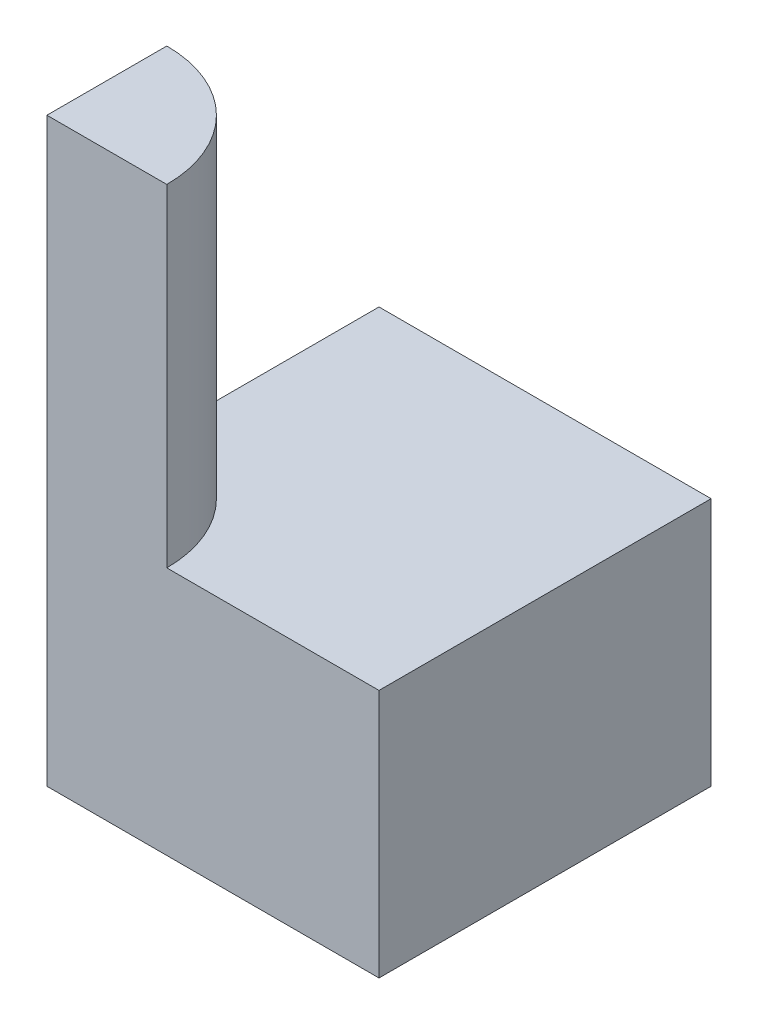
ISO-10303-21;
HEADER;
FILE_DESCRIPTION(('STEP AP214'),'2;1');
FILE_NAME('part.step','',(''),(''),'','','');
FILE_SCHEMA(('AUTOMOTIVE_DESIGN { 1 0 10303 214 1 1 1 1 }'));
ENDSEC;
DATA;
#1=APPLICATION_CONTEXT('core data for automotive mechanical design processes');
#2=APPLICATION_PROTOCOL_DEFINITION('international standard','automotive_design',2000,#1);
#3=PRODUCT_CONTEXT('',#1,'mechanical');
#4=PRODUCT('Part','Part','',(#3));
#5=PRODUCT_RELATED_PRODUCT_CATEGORY('part','',(#4));
#6=PRODUCT_DEFINITION_FORMATION('','',#4);
#7=PRODUCT_DEFINITION_CONTEXT('part definition',#1,'design');
#8=PRODUCT_DEFINITION('design','',#6,#7);
#9=PRODUCT_DEFINITION_SHAPE('','',#8);
#10=(LENGTH_UNIT() NAMED_UNIT(*) SI_UNIT(.MILLI.,.METRE.));
#11=(NAMED_UNIT(*) PLANE_ANGLE_UNIT() SI_UNIT($,.RADIAN.));
#12=(NAMED_UNIT(*) SI_UNIT($,.STERADIAN.) SOLID_ANGLE_UNIT());
#13=UNCERTAINTY_MEASURE_WITH_UNIT(LENGTH_MEASURE(1.E-05),#10,'distance_accuracy_value','');
#14=(GEOMETRIC_REPRESENTATION_CONTEXT(3) GLOBAL_UNCERTAINTY_ASSIGNED_CONTEXT((#13)) GLOBAL_UNIT_ASSIGNED_CONTEXT((#10,
#11,#12)) REPRESENTATION_CONTEXT('',''));
#15=CARTESIAN_POINT('',(0.,0.,0.));
#16=DIRECTION('',(0.,0.,1.));
#17=DIRECTION('',(1.,0.,0.));
#18=AXIS2_PLACEMENT_3D('',#15,#16,#17);
#19=CARTESIAN_POINT('',(0.,19.05,0.));
#20=DIRECTION('',(1.,0.,0.));
#21=DIRECTION('',(0.,0.,-1.));
#22=AXIS2_PLACEMENT_3D('',#19,#20,#21);
#23=PLANE('',#22);
#24=DIRECTION('',(0.,0.,1.));
#25=VECTOR('',#24,1.);
#26=CARTESIAN_POINT('',(0.,0.,0.));
#27=LINE('',#26,#25);
#28=CARTESIAN_POINT('',(0.,0.,-25.4));
#29=VERTEX_POINT('',#28);
#30=CARTESIAN_POINT('',(0.,0.,0.));
#31=VERTEX_POINT('',#30);
#32=EDGE_CURVE('E119',#29,#31,#27,.T.);
#33=ORIENTED_EDGE('',*,*,#32,.T.);
#34=DIRECTION('',(0.,-1.,0.));
#35=VECTOR('',#34,1.);
#36=CARTESIAN_POINT('',(0.,19.05,0.));
#37=LINE('',#36,#35);
#38=CARTESIAN_POINT('',(0.,44.45,0.));
#39=VERTEX_POINT('',#38);
#40=EDGE_CURVE('E11',#39,#31,#37,.T.);
#41=ORIENTED_EDGE('',*,*,#40,.F.);
#42=DIRECTION('',(0.,0.,1.));
#43=VECTOR('',#42,1.);
#44=CARTESIAN_POINT('',(0.,44.45,0.));
#45=LINE('',#44,#43);
#46=CARTESIAN_POINT('',(0.,44.45,-9.1694));
#47=VERTEX_POINT('',#46);
#48=EDGE_CURVE('E109',#47,#39,#45,.T.);
#49=ORIENTED_EDGE('',*,*,#48,.F.);
#50=DIRECTION('',(0.,-1.,0.));
#51=VECTOR('',#50,1.);
#52=CARTESIAN_POINT('',(0.,44.45,-9.1694));
#53=LINE('',#52,#51);
#54=CARTESIAN_POINT('',(0.,19.05,-9.1694));
#55=VERTEX_POINT('',#54);
#56=EDGE_CURVE('E104',#47,#55,#53,.T.);
#57=ORIENTED_EDGE('',*,*,#56,.T.);
#58=DIRECTION('',(0.,0.,1.));
#59=VECTOR('',#58,1.);
#60=CARTESIAN_POINT('',(0.,19.05,0.));
#61=LINE('',#60,#59);
#62=CARTESIAN_POINT('',(0.,19.05,-25.4));
#63=VERTEX_POINT('',#62);
#64=EDGE_CURVE('E129',#63,#55,#61,.T.);
#65=ORIENTED_EDGE('',*,*,#64,.F.);
#66=DIRECTION('',(0.,-1.,0.));
#67=VECTOR('',#66,1.);
#68=CARTESIAN_POINT('',(0.,19.05,-25.4));
#69=LINE('',#68,#67);
#70=EDGE_CURVE('E138',#63,#29,#69,.T.);
#71=ORIENTED_EDGE('',*,*,#70,.T.);
#72=EDGE_LOOP('',(#33,#41,#49,#57,#65,#71));
#73=FACE_BOUND('',#72,.T.);
#74=ADVANCED_FACE('F39',(#73),#23,.F.);
#75=CARTESIAN_POINT('',(0.,19.05,0.));
#76=DIRECTION('',(0.,0.,-1.));
#77=DIRECTION('',(-1.,0.,0.));
#78=AXIS2_PLACEMENT_3D('',#75,#76,#77);
#79=PLANE('',#78);
#80=DIRECTION('',(1.,0.,0.));
#81=VECTOR('',#80,1.);
#82=CARTESIAN_POINT('',(0.,0.,0.));
#83=LINE('',#82,#81);
#84=CARTESIAN_POINT('',(25.4,0.,0.));
#85=VERTEX_POINT('',#84);
#86=EDGE_CURVE('E124',#31,#85,#83,.T.);
#87=ORIENTED_EDGE('',*,*,#86,.T.);
#88=DIRECTION('',(0.,-1.,0.));
#89=VECTOR('',#88,1.);
#90=CARTESIAN_POINT('',(25.4,19.05,0.));
#91=LINE('',#90,#89);
#92=CARTESIAN_POINT('',(25.4,19.05,0.));
#93=VERTEX_POINT('',#92);
#94=EDGE_CURVE('E47',#93,#85,#91,.T.);
#95=ORIENTED_EDGE('',*,*,#94,.F.);
#96=DIRECTION('',(1.,0.,0.));
#97=VECTOR('',#96,1.);
#98=CARTESIAN_POINT('',(0.,19.05,0.));
#99=LINE('',#98,#97);
#100=CARTESIAN_POINT('',(9.1694,19.05,0.));
#101=VERTEX_POINT('',#100);
#102=EDGE_CURVE('E83',#101,#93,#99,.T.);
#103=ORIENTED_EDGE('',*,*,#102,.F.);
#104=DIRECTION('',(0.,-1.,0.));
#105=VECTOR('',#104,1.);
#106=CARTESIAN_POINT('',(9.1694,44.45,0.));
#107=LINE('',#106,#105);
#108=CARTESIAN_POINT('',(9.1694,44.45,0.));
#109=VERTEX_POINT('',#108);
#110=EDGE_CURVE('E102',#109,#101,#107,.T.);
#111=ORIENTED_EDGE('',*,*,#110,.F.);
#112=DIRECTION('',(1.,0.,0.));
#113=VECTOR('',#112,1.);
#114=CARTESIAN_POINT('',(0.,44.45,0.));
#115=LINE('',#114,#113);
#116=EDGE_CURVE('E110',#39,#109,#115,.T.);
#117=ORIENTED_EDGE('',*,*,#116,.F.);
#118=ORIENTED_EDGE('',*,*,#40,.T.);
#119=EDGE_LOOP('',(#87,#95,#103,#111,#117,#118));
#120=FACE_BOUND('',#119,.T.);
#121=ADVANCED_FACE('F117',(#120),#79,.F.);
#122=CARTESIAN_POINT('',(25.4,19.05,0.));
#123=DIRECTION('',(-1.,0.,0.));
#124=DIRECTION('',(0.,0.,1.));
#125=AXIS2_PLACEMENT_3D('',#122,#123,#124);
#126=PLANE('',#125);
#127=DIRECTION('',(0.,0.,-1.));
#128=VECTOR('',#127,1.);
#129=CARTESIAN_POINT('',(25.4,0.,0.));
#130=LINE('',#129,#128);
#131=CARTESIAN_POINT('',(25.4,0.,-25.4));
#132=VERTEX_POINT('',#131);
#133=EDGE_CURVE('E142',#85,#132,#130,.T.);
#134=ORIENTED_EDGE('',*,*,#133,.T.);
#135=DIRECTION('',(0.,-1.,0.));
#136=VECTOR('',#135,1.);
#137=CARTESIAN_POINT('',(25.4,19.05,-25.4));
#138=LINE('',#137,#136);
#139=CARTESIAN_POINT('',(25.4,19.05,-25.4));
#140=VERTEX_POINT('',#139);
#141=EDGE_CURVE('E149',#140,#132,#138,.T.);
#142=ORIENTED_EDGE('',*,*,#141,.F.);
#143=DIRECTION('',(0.,0.,-1.));
#144=VECTOR('',#143,1.);
#145=CARTESIAN_POINT('',(25.4,19.05,0.));
#146=LINE('',#145,#144);
#147=EDGE_CURVE('E134',#93,#140,#146,.T.);
#148=ORIENTED_EDGE('',*,*,#147,.F.);
#149=ORIENTED_EDGE('',*,*,#94,.T.);
#150=EDGE_LOOP('',(#134,#142,#148,#149));
#151=FACE_BOUND('',#150,.T.);
#152=ADVANCED_FACE('F156',(#151),#126,.F.);
#153=CARTESIAN_POINT('',(0.,19.05,-25.4));
#154=DIRECTION('',(0.,0.,1.));
#155=DIRECTION('',(1.,0.,0.));
#156=AXIS2_PLACEMENT_3D('',#153,#154,#155);
#157=PLANE('',#156);
#158=DIRECTION('',(-1.,0.,0.));
#159=VECTOR('',#158,1.);
#160=CARTESIAN_POINT('',(0.,0.,-25.4));
#161=LINE('',#160,#159);
#162=EDGE_CURVE('E81',#132,#29,#161,.T.);
#163=ORIENTED_EDGE('',*,*,#162,.T.);
#164=ORIENTED_EDGE('',*,*,#70,.F.);
#165=DIRECTION('',(-1.,0.,0.));
#166=VECTOR('',#165,1.);
#167=CARTESIAN_POINT('',(0.,19.05,-25.4));
#168=LINE('',#167,#166);
#169=EDGE_CURVE('E61',#140,#63,#168,.T.);
#170=ORIENTED_EDGE('',*,*,#169,.F.);
#171=ORIENTED_EDGE('',*,*,#141,.T.);
#172=EDGE_LOOP('',(#163,#164,#170,#171));
#173=FACE_BOUND('',#172,.T.);
#174=ADVANCED_FACE('F163',(#173),#157,.F.);
#175=CARTESIAN_POINT('',(0.,19.05,0.));
#176=DIRECTION('',(0.,-1.,0.));
#177=DIRECTION('',(0.,0.,-1.));
#178=AXIS2_PLACEMENT_3D('',#175,#176,#177);
#179=PLANE('',#178);
#180=CARTESIAN_POINT('',(0.,19.05,0.));
#181=DIRECTION('',(0.,1.,0.));
#182=DIRECTION('',(0.,0.,-1.));
#183=AXIS2_PLACEMENT_3D('',#180,#181,#182);
#184=CIRCLE('',#183,9.1694);
#185=EDGE_CURVE('E54',#101,#55,#184,.T.);
#186=ORIENTED_EDGE('',*,*,#185,.F.);
#187=ORIENTED_EDGE('',*,*,#102,.T.);
#188=ORIENTED_EDGE('',*,*,#147,.T.);
#189=ORIENTED_EDGE('',*,*,#169,.T.);
#190=ORIENTED_EDGE('',*,*,#64,.T.);
#191=EDGE_LOOP('',(#186,#187,#188,#189,#190));
#192=FACE_BOUND('',#191,.T.);
#193=ADVANCED_FACE('F165',(#192),#179,.F.);
#194=CARTESIAN_POINT('',(0.,0.,0.));
#195=DIRECTION('',(0.,-1.,0.));
#196=DIRECTION('',(0.,0.,-1.));
#197=AXIS2_PLACEMENT_3D('',#194,#195,#196);
#198=PLANE('',#197);
#199=ORIENTED_EDGE('',*,*,#32,.F.);
#200=ORIENTED_EDGE('',*,*,#162,.F.);
#201=ORIENTED_EDGE('',*,*,#133,.F.);
#202=ORIENTED_EDGE('',*,*,#86,.F.);
#203=EDGE_LOOP('',(#199,#200,#201,#202));
#204=FACE_BOUND('',#203,.T.);
#205=ADVANCED_FACE('F160',(#204),#198,.T.);
#206=CARTESIAN_POINT('',(0.,44.45,0.));
#207=DIRECTION('',(0.,-1.,0.));
#208=DIRECTION('',(0.,0.,-1.));
#209=AXIS2_PLACEMENT_3D('',#206,#207,#208);
#210=CYLINDRICAL_SURFACE('',#209,9.1694);
#211=ORIENTED_EDGE('',*,*,#185,.T.);
#212=ORIENTED_EDGE('',*,*,#56,.F.);
#213=CARTESIAN_POINT('',(0.,44.45,0.));
#214=DIRECTION('',(0.,1.,0.));
#215=DIRECTION('',(0.,0.,-1.));
#216=AXIS2_PLACEMENT_3D('',#213,#214,#215);
#217=CIRCLE('',#216,9.1694);
#218=EDGE_CURVE('E98',#109,#47,#217,.T.);
#219=ORIENTED_EDGE('',*,*,#218,.F.);
#220=ORIENTED_EDGE('',*,*,#110,.T.);
#221=EDGE_LOOP('',(#211,#212,#219,#220));
#222=FACE_BOUND('',#221,.T.);
#223=ADVANCED_FACE('F100',(#222),#210,.T.);
#224=CARTESIAN_POINT('',(0.,44.45,0.));
#225=DIRECTION('',(0.,-1.,0.));
#226=DIRECTION('',(0.,0.,-1.));
#227=AXIS2_PLACEMENT_3D('',#224,#225,#226);
#228=PLANE('',#227);
#229=ORIENTED_EDGE('',*,*,#116,.T.);
#230=ORIENTED_EDGE('',*,*,#218,.T.);
#231=ORIENTED_EDGE('',*,*,#48,.T.);
#232=EDGE_LOOP('',(#229,#230,#231));
#233=FACE_BOUND('',#232,.T.);
#234=ADVANCED_FACE('F113',(#233),#228,.F.);
#235=CLOSED_SHELL('',(#74,#121,#152,#174,#193,#205,#223,#234));
#236=MANIFOLD_SOLID_BREP('B2',#235);
#237=ADVANCED_BREP_SHAPE_REPRESENTATION('',(#18,#236),#14);
#238=SHAPE_DEFINITION_REPRESENTATION(#9,#237);
ENDSEC;
END-ISO-10303-21;
